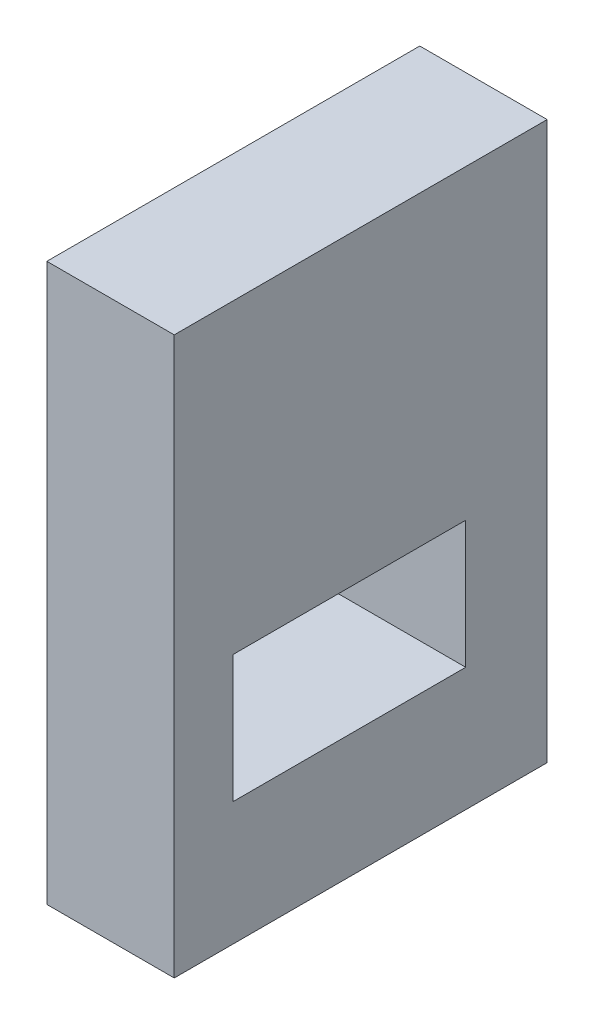
ISO-10303-21;
HEADER;
FILE_DESCRIPTION(('STEP AP214'),'2;1');
FILE_NAME('part.step','',(''),(''),'','','');
FILE_SCHEMA(('AUTOMOTIVE_DESIGN { 1 0 10303 214 1 1 1 1 }'));
ENDSEC;
DATA;
#1=APPLICATION_CONTEXT('core data for automotive mechanical design processes');
#2=APPLICATION_PROTOCOL_DEFINITION('international standard','automotive_design',2000,#1);
#3=PRODUCT_CONTEXT('',#1,'mechanical');
#4=PRODUCT('Part','Part','',(#3));
#5=PRODUCT_RELATED_PRODUCT_CATEGORY('part','',(#4));
#6=PRODUCT_DEFINITION_FORMATION('','',#4);
#7=PRODUCT_DEFINITION_CONTEXT('part definition',#1,'design');
#8=PRODUCT_DEFINITION('design','',#6,#7);
#9=PRODUCT_DEFINITION_SHAPE('','',#8);
#10=(LENGTH_UNIT() NAMED_UNIT(*) SI_UNIT(.MILLI.,.METRE.));
#11=(NAMED_UNIT(*) PLANE_ANGLE_UNIT() SI_UNIT($,.RADIAN.));
#12=(NAMED_UNIT(*) SI_UNIT($,.STERADIAN.) SOLID_ANGLE_UNIT());
#13=UNCERTAINTY_MEASURE_WITH_UNIT(LENGTH_MEASURE(1.E-05),#10,'distance_accuracy_value','');
#14=(GEOMETRIC_REPRESENTATION_CONTEXT(3) GLOBAL_UNCERTAINTY_ASSIGNED_CONTEXT((#13)) GLOBAL_UNIT_ASSIGNED_CONTEXT((#10,
#11,#12)) REPRESENTATION_CONTEXT('',''));
#15=CARTESIAN_POINT('',(0.,0.,0.));
#16=DIRECTION('',(0.,0.,1.));
#17=DIRECTION('',(1.,0.,0.));
#18=AXIS2_PLACEMENT_3D('',#15,#16,#17);
#19=CARTESIAN_POINT('',(25.,0.,0.));
#20=DIRECTION('',(1.,0.,0.));
#21=DIRECTION('',(0.,0.,-1.));
#22=AXIS2_PLACEMENT_3D('',#19,#20,#21);
#23=PLANE('',#22);
#24=DIRECTION('',(0.,1.,0.));
#25=VECTOR('',#24,1.);
#26=CARTESIAN_POINT('',(25.,-98.4177436316998,-69.6979318468607));
#27=LINE('',#26,#25);
#28=CARTESIAN_POINT('',(25.,-98.4177436316998,-69.6979318468607));
#29=VERTEX_POINT('',#28);
#30=CARTESIAN_POINT('',(25.,120.214973002817,-69.6979318468607));
#31=VERTEX_POINT('',#30);
#32=EDGE_CURVE('E132',#29,#31,#27,.T.);
#33=ORIENTED_EDGE('',*,*,#32,.T.);
#34=DIRECTION('',(0.,0.,1.));
#35=VECTOR('',#34,1.);
#36=CARTESIAN_POINT('',(25.,120.214973002817,-69.6979318468607));
#37=LINE('',#36,#35);
#38=CARTESIAN_POINT('',(25.,120.214973002817,76.6790100679771));
#39=VERTEX_POINT('',#38);
#40=EDGE_CURVE('E144',#31,#39,#37,.T.);
#41=ORIENTED_EDGE('',*,*,#40,.T.);
#42=DIRECTION('',(0.,-1.,0.));
#43=VECTOR('',#42,1.);
#44=CARTESIAN_POINT('',(25.,-98.4177436316998,76.6790100679771));
#45=LINE('',#44,#43);
#46=CARTESIAN_POINT('',(25.,-98.4177436316998,76.6790100679771));
#47=VERTEX_POINT('',#46);
#48=EDGE_CURVE('E142',#39,#47,#45,.T.);
#49=ORIENTED_EDGE('',*,*,#48,.T.);
#50=DIRECTION('',(0.,0.,-1.));
#51=VECTOR('',#50,1.);
#52=CARTESIAN_POINT('',(25.,-98.4177436316998,-69.6979318468607));
#53=LINE('',#52,#51);
#54=EDGE_CURVE('E129',#47,#29,#53,.T.);
#55=ORIENTED_EDGE('',*,*,#54,.T.);
#56=EDGE_LOOP('',(#33,#41,#49,#55));
#57=FACE_BOUND('',#56,.T.);
#58=DIRECTION('',(0.,-1.,0.));
#59=VECTOR('',#58,1.);
#60=CARTESIAN_POINT('',(25.,0.,-37.7356756695876));
#61=LINE('',#60,#59);
#62=CARTESIAN_POINT('',(25.,0.,-37.7356756695876));
#63=VERTEX_POINT('',#62);
#64=CARTESIAN_POINT('',(25.,-50.,-37.7356756695876));
#65=VERTEX_POINT('',#64);
#66=EDGE_CURVE('E111',#63,#65,#61,.T.);
#67=ORIENTED_EDGE('',*,*,#66,.T.);
#68=DIRECTION('',(0.,0.,1.));
#69=VECTOR('',#68,1.);
#70=CARTESIAN_POINT('',(25.,-50.,0.));
#71=LINE('',#70,#69);
#72=CARTESIAN_POINT('',(25.,-50.,53.5257810916135));
#73=VERTEX_POINT('',#72);
#74=EDGE_CURVE('E150',#65,#73,#71,.T.);
#75=ORIENTED_EDGE('',*,*,#74,.T.);
#76=DIRECTION('',(0.,-1.,0.));
#77=VECTOR('',#76,1.);
#78=CARTESIAN_POINT('',(25.,0.,53.5257810916135));
#79=LINE('',#78,#77);
#80=CARTESIAN_POINT('',(25.,0.,53.5257810916135));
#81=VERTEX_POINT('',#80);
#82=EDGE_CURVE('E140',#81,#73,#79,.T.);
#83=ORIENTED_EDGE('',*,*,#82,.F.);
#84=DIRECTION('',(0.,0.,1.));
#85=VECTOR('',#84,1.);
#86=CARTESIAN_POINT('',(25.,0.,0.));
#87=LINE('',#86,#85);
#88=EDGE_CURVE('E153',#63,#81,#87,.T.);
#89=ORIENTED_EDGE('',*,*,#88,.F.);
#90=EDGE_LOOP('',(#67,#75,#83,#89));
#91=FACE_BOUND('',#90,.T.);
#92=ADVANCED_FACE('F37',(#57,#91),#23,.T.);
#93=CARTESIAN_POINT('',(-25.,0.,0.));
#94=DIRECTION('',(1.,0.,0.));
#95=DIRECTION('',(0.,0.,-1.));
#96=AXIS2_PLACEMENT_3D('',#93,#94,#95);
#97=PLANE('',#96);
#98=DIRECTION('',(0.,1.,0.));
#99=VECTOR('',#98,1.);
#100=CARTESIAN_POINT('',(-25.,-98.4177436316998,-69.6979318468607));
#101=LINE('',#100,#99);
#102=CARTESIAN_POINT('',(-25.,-98.4177436316998,-69.6979318468607));
#103=VERTEX_POINT('',#102);
#104=CARTESIAN_POINT('',(-25.,120.214973002817,-69.6979318468607));
#105=VERTEX_POINT('',#104);
#106=EDGE_CURVE('E137',#103,#105,#101,.T.);
#107=ORIENTED_EDGE('',*,*,#106,.F.);
#108=DIRECTION('',(0.,0.,-1.));
#109=VECTOR('',#108,1.);
#110=CARTESIAN_POINT('',(-25.,-98.4177436316998,-69.6979318468607));
#111=LINE('',#110,#109);
#112=CARTESIAN_POINT('',(-25.,-98.4177436316998,76.6790100679771));
#113=VERTEX_POINT('',#112);
#114=EDGE_CURVE('E130',#113,#103,#111,.T.);
#115=ORIENTED_EDGE('',*,*,#114,.F.);
#116=DIRECTION('',(0.,-1.,0.));
#117=VECTOR('',#116,1.);
#118=CARTESIAN_POINT('',(-25.,-98.4177436316998,76.6790100679771));
#119=LINE('',#118,#117);
#120=CARTESIAN_POINT('',(-25.,120.214973002817,76.6790100679771));
#121=VERTEX_POINT('',#120);
#122=EDGE_CURVE('E133',#121,#113,#119,.T.);
#123=ORIENTED_EDGE('',*,*,#122,.F.);
#124=DIRECTION('',(0.,0.,1.));
#125=VECTOR('',#124,1.);
#126=CARTESIAN_POINT('',(-25.,120.214973002817,-69.6979318468607));
#127=LINE('',#126,#125);
#128=EDGE_CURVE('E135',#105,#121,#127,.T.);
#129=ORIENTED_EDGE('',*,*,#128,.F.);
#130=EDGE_LOOP('',(#107,#115,#123,#129));
#131=FACE_BOUND('',#130,.T.);
#132=DIRECTION('',(0.,0.,1.));
#133=VECTOR('',#132,1.);
#134=CARTESIAN_POINT('',(-25.,-50.,0.));
#135=LINE('',#134,#133);
#136=CARTESIAN_POINT('',(-25.,-50.,-37.7356756695876));
#137=VERTEX_POINT('',#136);
#138=CARTESIAN_POINT('',(-25.,-50.,53.5257810916135));
#139=VERTEX_POINT('',#138);
#140=EDGE_CURVE('E11',#137,#139,#135,.T.);
#141=ORIENTED_EDGE('',*,*,#140,.F.);
#142=DIRECTION('',(0.,-1.,0.));
#143=VECTOR('',#142,1.);
#144=CARTESIAN_POINT('',(-25.,0.,-37.7356756695876));
#145=LINE('',#144,#143);
#146=CARTESIAN_POINT('',(-25.,0.,-37.7356756695876));
#147=VERTEX_POINT('',#146);
#148=EDGE_CURVE('E103',#147,#137,#145,.T.);
#149=ORIENTED_EDGE('',*,*,#148,.F.);
#150=DIRECTION('',(0.,0.,1.));
#151=VECTOR('',#150,1.);
#152=CARTESIAN_POINT('',(-25.,0.,0.));
#153=LINE('',#152,#151);
#154=CARTESIAN_POINT('',(-25.,0.,53.5257810916135));
#155=VERTEX_POINT('',#154);
#156=EDGE_CURVE('E98',#147,#155,#153,.T.);
#157=ORIENTED_EDGE('',*,*,#156,.T.);
#158=DIRECTION('',(0.,-1.,0.));
#159=VECTOR('',#158,1.);
#160=CARTESIAN_POINT('',(-25.,0.,53.5257810916135));
#161=LINE('',#160,#159);
#162=EDGE_CURVE('E45',#155,#139,#161,.T.);
#163=ORIENTED_EDGE('',*,*,#162,.T.);
#164=EDGE_LOOP('',(#141,#149,#157,#163));
#165=FACE_BOUND('',#164,.T.);
#166=ADVANCED_FACE('F115',(#131,#165),#97,.F.);
#167=CARTESIAN_POINT('',(25.,-98.4177436316998,-69.6979318468607));
#168=DIRECTION('',(0.,0.,1.));
#169=DIRECTION('',(1.,0.,0.));
#170=AXIS2_PLACEMENT_3D('',#167,#168,#169);
#171=PLANE('',#170);
#172=ORIENTED_EDGE('',*,*,#106,.T.);
#173=DIRECTION('',(-1.,0.,0.));
#174=VECTOR('',#173,1.);
#175=CARTESIAN_POINT('',(25.,120.214973002817,-69.6979318468607));
#176=LINE('',#175,#174);
#177=EDGE_CURVE('E104',#31,#105,#176,.T.);
#178=ORIENTED_EDGE('',*,*,#177,.F.);
#179=ORIENTED_EDGE('',*,*,#32,.F.);
#180=DIRECTION('',(-1.,0.,0.));
#181=VECTOR('',#180,1.);
#182=CARTESIAN_POINT('',(25.,-98.4177436316998,-69.6979318468607));
#183=LINE('',#182,#181);
#184=EDGE_CURVE('E126',#29,#103,#183,.T.);
#185=ORIENTED_EDGE('',*,*,#184,.T.);
#186=EDGE_LOOP('',(#172,#178,#179,#185));
#187=FACE_BOUND('',#186,.T.);
#188=ADVANCED_FACE('F39',(#187),#171,.F.);
#189=CARTESIAN_POINT('',(25.,120.214973002817,-69.6979318468607));
#190=DIRECTION('',(0.,-1.,0.));
#191=DIRECTION('',(0.,0.,-1.));
#192=AXIS2_PLACEMENT_3D('',#189,#190,#191);
#193=PLANE('',#192);
#194=ORIENTED_EDGE('',*,*,#128,.T.);
#195=DIRECTION('',(-1.,0.,0.));
#196=VECTOR('',#195,1.);
#197=CARTESIAN_POINT('',(25.,120.214973002817,76.6790100679771));
#198=LINE('',#197,#196);
#199=EDGE_CURVE('E120',#39,#121,#198,.T.);
#200=ORIENTED_EDGE('',*,*,#199,.F.);
#201=ORIENTED_EDGE('',*,*,#40,.F.);
#202=ORIENTED_EDGE('',*,*,#177,.T.);
#203=EDGE_LOOP('',(#194,#200,#201,#202));
#204=FACE_BOUND('',#203,.T.);
#205=ADVANCED_FACE('F191',(#204),#193,.F.);
#206=CARTESIAN_POINT('',(25.,-98.4177436316998,76.6790100679771));
#207=DIRECTION('',(0.,0.,-1.));
#208=DIRECTION('',(-1.,0.,0.));
#209=AXIS2_PLACEMENT_3D('',#206,#207,#208);
#210=PLANE('',#209);
#211=ORIENTED_EDGE('',*,*,#122,.T.);
#212=DIRECTION('',(-1.,0.,0.));
#213=VECTOR('',#212,1.);
#214=CARTESIAN_POINT('',(25.,-98.4177436316998,76.6790100679771));
#215=LINE('',#214,#213);
#216=EDGE_CURVE('E123',#47,#113,#215,.T.);
#217=ORIENTED_EDGE('',*,*,#216,.F.);
#218=ORIENTED_EDGE('',*,*,#48,.F.);
#219=ORIENTED_EDGE('',*,*,#199,.T.);
#220=EDGE_LOOP('',(#211,#217,#218,#219));
#221=FACE_BOUND('',#220,.T.);
#222=ADVANCED_FACE('F188',(#221),#210,.F.);
#223=CARTESIAN_POINT('',(25.,-98.4177436316998,-69.6979318468607));
#224=DIRECTION('',(0.,1.,0.));
#225=DIRECTION('',(0.,0.,1.));
#226=AXIS2_PLACEMENT_3D('',#223,#224,#225);
#227=PLANE('',#226);
#228=ORIENTED_EDGE('',*,*,#114,.T.);
#229=ORIENTED_EDGE('',*,*,#184,.F.);
#230=ORIENTED_EDGE('',*,*,#54,.F.);
#231=ORIENTED_EDGE('',*,*,#216,.T.);
#232=EDGE_LOOP('',(#228,#229,#230,#231));
#233=FACE_BOUND('',#232,.T.);
#234=ADVANCED_FACE('F185',(#233),#227,.F.);
#235=CARTESIAN_POINT('',(0.,-50.,53.5257810916135));
#236=DIRECTION('',(0.,0.,1.));
#237=DIRECTION('',(1.,0.,0.));
#238=AXIS2_PLACEMENT_3D('',#235,#236,#237);
#239=PLANE('',#238);
#240=ORIENTED_EDGE('',*,*,#82,.T.);
#241=DIRECTION('',(1.,0.,0.));
#242=VECTOR('',#241,1.);
#243=CARTESIAN_POINT('',(0.,-50.,53.5257810916135));
#244=LINE('',#243,#242);
#245=EDGE_CURVE('E155',#139,#73,#244,.T.);
#246=ORIENTED_EDGE('',*,*,#245,.F.);
#247=ORIENTED_EDGE('',*,*,#162,.F.);
#248=DIRECTION('',(1.,0.,0.));
#249=VECTOR('',#248,1.);
#250=CARTESIAN_POINT('',(0.,0.,53.5257810916135));
#251=LINE('',#250,#249);
#252=EDGE_CURVE('E57',#155,#81,#251,.T.);
#253=ORIENTED_EDGE('',*,*,#252,.T.);
#254=EDGE_LOOP('',(#240,#246,#247,#253));
#255=FACE_BOUND('',#254,.T.);
#256=ADVANCED_FACE('F164',(#255),#239,.F.);
#257=CARTESIAN_POINT('',(0.,-50.,-37.7356756695876));
#258=DIRECTION('',(0.,0.,1.));
#259=DIRECTION('',(1.,0.,0.));
#260=AXIS2_PLACEMENT_3D('',#257,#258,#259);
#261=PLANE('',#260);
#262=DIRECTION('',(1.,0.,0.));
#263=VECTOR('',#262,1.);
#264=CARTESIAN_POINT('',(0.,0.,-37.7356756695876));
#265=LINE('',#264,#263);
#266=EDGE_CURVE('E52',#147,#63,#265,.T.);
#267=ORIENTED_EDGE('',*,*,#266,.F.);
#268=ORIENTED_EDGE('',*,*,#148,.T.);
#269=DIRECTION('',(1.,0.,0.));
#270=VECTOR('',#269,1.);
#271=CARTESIAN_POINT('',(0.,-50.,-37.7356756695876));
#272=LINE('',#271,#270);
#273=EDGE_CURVE('E156',#137,#65,#272,.T.);
#274=ORIENTED_EDGE('',*,*,#273,.T.);
#275=ORIENTED_EDGE('',*,*,#66,.F.);
#276=EDGE_LOOP('',(#267,#268,#274,#275));
#277=FACE_BOUND('',#276,.T.);
#278=ADVANCED_FACE('F107',(#277),#261,.T.);
#279=CARTESIAN_POINT('',(0.,-50.,0.));
#280=DIRECTION('',(0.,1.,0.));
#281=DIRECTION('',(0.,0.,1.));
#282=AXIS2_PLACEMENT_3D('',#279,#280,#281);
#283=PLANE('',#282);
#284=ORIENTED_EDGE('',*,*,#273,.F.);
#285=ORIENTED_EDGE('',*,*,#140,.T.);
#286=ORIENTED_EDGE('',*,*,#245,.T.);
#287=ORIENTED_EDGE('',*,*,#74,.F.);
#288=EDGE_LOOP('',(#284,#285,#286,#287));
#289=FACE_BOUND('',#288,.T.);
#290=ADVANCED_FACE('F166',(#289),#283,.T.);
#291=CARTESIAN_POINT('',(0.,0.,0.));
#292=DIRECTION('',(0.,1.,0.));
#293=DIRECTION('',(0.,0.,1.));
#294=AXIS2_PLACEMENT_3D('',#291,#292,#293);
#295=PLANE('',#294);
#296=ORIENTED_EDGE('',*,*,#88,.T.);
#297=ORIENTED_EDGE('',*,*,#252,.F.);
#298=ORIENTED_EDGE('',*,*,#156,.F.);
#299=ORIENTED_EDGE('',*,*,#266,.T.);
#300=EDGE_LOOP('',(#296,#297,#298,#299));
#301=FACE_BOUND('',#300,.T.);
#302=ADVANCED_FACE('F99',(#301),#295,.F.);
#303=CLOSED_SHELL('',(#92,#166,#188,#205,#222,#234,#256,#278,#290,#302));
#304=MANIFOLD_SOLID_BREP('B2',#303);
#305=ADVANCED_BREP_SHAPE_REPRESENTATION('',(#18,#304),#14);
#306=SHAPE_DEFINITION_REPRESENTATION(#9,#305);
ENDSEC;
END-ISO-10303-21;
